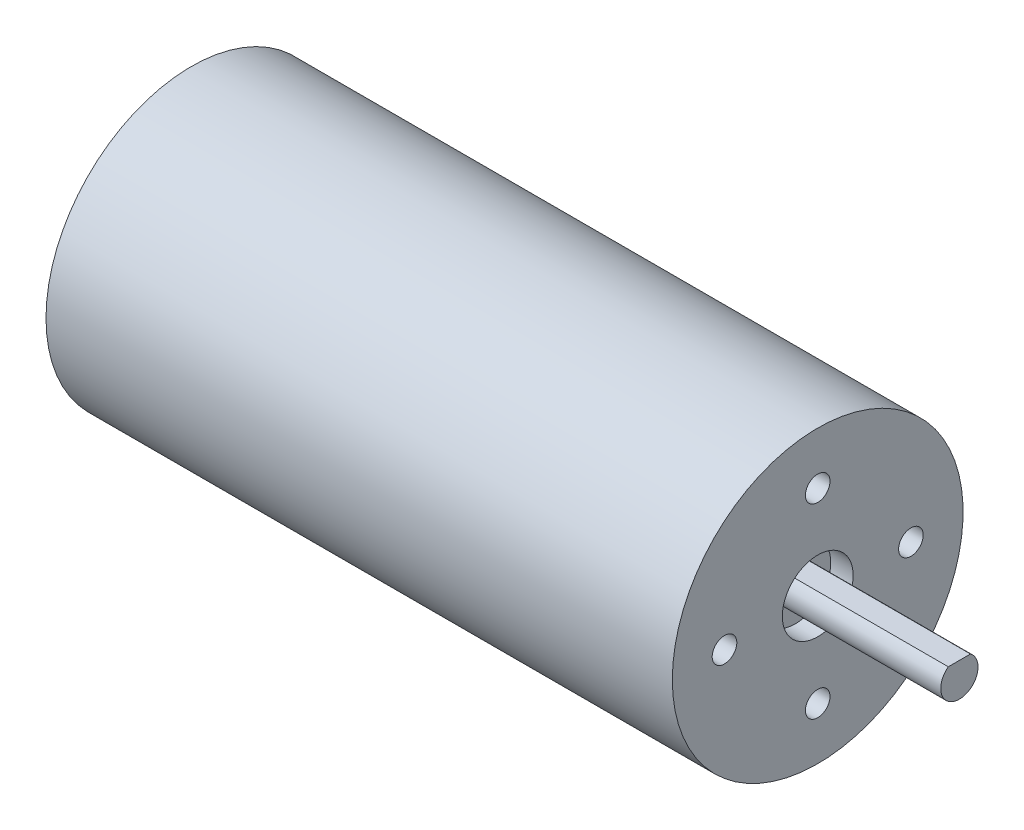
ISO-10303-21;
HEADER;
FILE_DESCRIPTION(('STEP AP214'),'2;1');
FILE_NAME('part.step','',(''),(''),'','','');
FILE_SCHEMA(('AUTOMOTIVE_DESIGN { 1 0 10303 214 1 1 1 1 }'));
ENDSEC;
DATA;
#1=APPLICATION_CONTEXT('core data for automotive mechanical design processes');
#2=APPLICATION_PROTOCOL_DEFINITION('international standard','automotive_design',2000,#1);
#3=PRODUCT_CONTEXT('',#1,'mechanical');
#4=PRODUCT('Part','Part','',(#3));
#5=PRODUCT_RELATED_PRODUCT_CATEGORY('part','',(#4));
#6=PRODUCT_DEFINITION_FORMATION('','',#4);
#7=PRODUCT_DEFINITION_CONTEXT('part definition',#1,'design');
#8=PRODUCT_DEFINITION('design','',#6,#7);
#9=PRODUCT_DEFINITION_SHAPE('','',#8);
#10=(LENGTH_UNIT() NAMED_UNIT(*) SI_UNIT(.MILLI.,.METRE.));
#11=(NAMED_UNIT(*) PLANE_ANGLE_UNIT() SI_UNIT($,.RADIAN.));
#12=(NAMED_UNIT(*) SI_UNIT($,.STERADIAN.) SOLID_ANGLE_UNIT());
#13=UNCERTAINTY_MEASURE_WITH_UNIT(LENGTH_MEASURE(1.E-05),#10,'distance_accuracy_value','');
#14=(GEOMETRIC_REPRESENTATION_CONTEXT(3) GLOBAL_UNCERTAINTY_ASSIGNED_CONTEXT((#13)) GLOBAL_UNIT_ASSIGNED_CONTEXT((#10,
#11,#12)) REPRESENTATION_CONTEXT('',''));
#15=CARTESIAN_POINT('',(0.,0.,0.));
#16=DIRECTION('',(0.,0.,1.));
#17=DIRECTION('',(1.,0.,0.));
#18=AXIS2_PLACEMENT_3D('',#15,#16,#17);
#19=CARTESIAN_POINT('',(39.,0.,0.));
#20=DIRECTION('',(1.,0.,0.));
#21=DIRECTION('',(0.,0.,-1.));
#22=AXIS2_PLACEMENT_3D('',#19,#20,#21);
#23=PLANE('',#22);
#24=CARTESIAN_POINT('',(39.,0.,0.));
#25=DIRECTION('',(1.,0.,0.));
#26=DIRECTION('',(0.,0.,-1.));
#27=AXIS2_PLACEMENT_3D('',#24,#25,#26);
#28=CIRCLE('',#27,4.75);
#29=CARTESIAN_POINT('',(39.,0.,-4.75));
#30=VERTEX_POINT('',#29);
#31=EDGE_CURVE('E178',#30,#30,#28,.T.);
#32=ORIENTED_EDGE('',*,*,#31,.T.);
#33=EDGE_LOOP('',(#32));
#34=FACE_BOUND('',#33,.T.);
#35=DIRECTION('',(0.,0.,1.));
#36=VECTOR('',#35,1.);
#37=CARTESIAN_POINT('',(39.,2.01,1.48657324071167));
#38=LINE('',#37,#36);
#39=CARTESIAN_POINT('',(39.,2.01,-1.48657324071167));
#40=VERTEX_POINT('',#39);
#41=CARTESIAN_POINT('',(39.,2.01,1.48657324071167));
#42=VERTEX_POINT('',#41);
#43=EDGE_CURVE('E169',#40,#42,#38,.T.);
#44=ORIENTED_EDGE('',*,*,#43,.F.);
#45=CARTESIAN_POINT('',(39.,0.,0.));
#46=DIRECTION('',(1.,0.,0.));
#47=DIRECTION('',(0.,0.,-1.));
#48=AXIS2_PLACEMENT_3D('',#45,#46,#47);
#49=CIRCLE('',#48,2.5);
#50=EDGE_CURVE('E55',#42,#40,#49,.T.);
#51=ORIENTED_EDGE('',*,*,#50,.F.);
#52=EDGE_LOOP('',(#44,#51));
#53=FACE_BOUND('',#52,.T.);
#54=ADVANCED_FACE('F32',(#34,#53),#23,.T.);
#55=CARTESIAN_POINT('',(42.,0.,0.));
#56=DIRECTION('',(-1.,0.,0.));
#57=DIRECTION('',(0.,0.,1.));
#58=AXIS2_PLACEMENT_3D('',#55,#56,#57);
#59=CYLINDRICAL_SURFACE('',#58,19.5);
#60=CARTESIAN_POINT('',(42.,0.,0.));
#61=DIRECTION('',(1.,0.,0.));
#62=DIRECTION('',(0.,0.,-1.));
#63=AXIS2_PLACEMENT_3D('',#60,#61,#62);
#64=CIRCLE('',#63,19.5);
#65=CARTESIAN_POINT('',(42.,0.,19.5));
#66=VERTEX_POINT('',#65);
#67=EDGE_CURVE('E11',#66,#66,#64,.T.);
#68=CARTESIAN_POINT('',(-42.,0.,0.));
#69=DIRECTION('',(1.,0.,0.));
#70=DIRECTION('',(0.,0.,-1.));
#71=AXIS2_PLACEMENT_3D('',#68,#69,#70);
#72=CIRCLE('',#71,19.5);
#73=CARTESIAN_POINT('',(-42.,0.,19.5));
#74=VERTEX_POINT('',#73);
#75=EDGE_CURVE('E36',#74,#74,#72,.T.);
#76=CARTESIAN_POINT('',(42.,0.,19.5));
#77=CARTESIAN_POINT('',(41.125,0.,19.5));
#78=CARTESIAN_POINT('',(40.25,0.,19.5));
#79=CARTESIAN_POINT('',(38.5,0.,19.5));
#80=CARTESIAN_POINT('',(37.625,0.,19.5));
#81=CARTESIAN_POINT('',(35.875,0.,19.5));
#82=CARTESIAN_POINT('',(35.,0.,19.5));
#83=CARTESIAN_POINT('',(33.25,0.,19.5));
#84=CARTESIAN_POINT('',(32.375,0.,19.5));
#85=CARTESIAN_POINT('',(30.625,0.,19.5));
#86=CARTESIAN_POINT('',(29.75,0.,19.5));
#87=CARTESIAN_POINT('',(28.,0.,19.5));
#88=CARTESIAN_POINT('',(27.125,0.,19.5));
#89=CARTESIAN_POINT('',(25.375,0.,19.5));
#90=CARTESIAN_POINT('',(24.5,0.,19.5));
#91=CARTESIAN_POINT('',(22.75,0.,19.5));
#92=CARTESIAN_POINT('',(21.875,0.,19.5));
#93=CARTESIAN_POINT('',(20.125,0.,19.5));
#94=CARTESIAN_POINT('',(19.25,0.,19.5));
#95=CARTESIAN_POINT('',(17.5,0.,19.5));
#96=CARTESIAN_POINT('',(16.625,0.,19.5));
#97=CARTESIAN_POINT('',(14.875,0.,19.5));
#98=CARTESIAN_POINT('',(14.,0.,19.5));
#99=CARTESIAN_POINT('',(12.25,0.,19.5));
#100=CARTESIAN_POINT('',(11.375,0.,19.5));
#101=CARTESIAN_POINT('',(9.62499999999999,0.,19.5));
#102=CARTESIAN_POINT('',(8.74999999999999,0.,19.5));
#103=CARTESIAN_POINT('',(6.99999999999999,0.,19.5));
#104=CARTESIAN_POINT('',(6.125,0.,19.5));
#105=CARTESIAN_POINT('',(4.375,0.,19.5));
#106=CARTESIAN_POINT('',(3.5,0.,19.5));
#107=CARTESIAN_POINT('',(1.74999999999999,0.,19.5));
#108=CARTESIAN_POINT('',(0.874999999999994,0.,19.5));
#109=CARTESIAN_POINT('',(-0.875000000000008,0.,19.5));
#110=CARTESIAN_POINT('',(-1.75000000000001,0.,19.5));
#111=CARTESIAN_POINT('',(-3.50000000000001,0.,19.5));
#112=CARTESIAN_POINT('',(-4.37500000000001,0.,19.5));
#113=CARTESIAN_POINT('',(-6.12500000000001,0.,19.5));
#114=CARTESIAN_POINT('',(-7.00000000000001,0.,19.5));
#115=CARTESIAN_POINT('',(-8.75000000000001,0.,19.5));
#116=CARTESIAN_POINT('',(-9.62500000000001,0.,19.5));
#117=CARTESIAN_POINT('',(-11.375,0.,19.5));
#118=CARTESIAN_POINT('',(-12.25,0.,19.5));
#119=CARTESIAN_POINT('',(-14.,0.,19.5));
#120=CARTESIAN_POINT('',(-14.875,0.,19.5));
#121=CARTESIAN_POINT('',(-16.625,0.,19.5));
#122=CARTESIAN_POINT('',(-17.5,0.,19.5));
#123=CARTESIAN_POINT('',(-19.25,0.,19.5));
#124=CARTESIAN_POINT('',(-20.125,0.,19.5));
#125=CARTESIAN_POINT('',(-21.875,0.,19.5));
#126=CARTESIAN_POINT('',(-22.75,0.,19.5));
#127=CARTESIAN_POINT('',(-24.5,0.,19.5));
#128=CARTESIAN_POINT('',(-25.375,0.,19.5));
#129=CARTESIAN_POINT('',(-27.125,0.,19.5));
#130=CARTESIAN_POINT('',(-28.,0.,19.5));
#131=CARTESIAN_POINT('',(-29.75,0.,19.5));
#132=CARTESIAN_POINT('',(-30.625,0.,19.5));
#133=CARTESIAN_POINT('',(-32.375,0.,19.5));
#134=CARTESIAN_POINT('',(-33.25,0.,19.5));
#135=CARTESIAN_POINT('',(-35.,0.,19.5));
#136=CARTESIAN_POINT('',(-35.875,0.,19.5));
#137=CARTESIAN_POINT('',(-37.625,0.,19.5));
#138=CARTESIAN_POINT('',(-38.5,0.,19.5));
#139=CARTESIAN_POINT('',(-40.25,0.,19.5));
#140=CARTESIAN_POINT('',(-41.125,0.,19.5));
#141=CARTESIAN_POINT('',(-42.,0.,19.5));
#142=B_SPLINE_CURVE_WITH_KNOTS('',3,(#76,#77,#78,#79,#80,#81,#82,#83,#84,#85,#86,#87,#88,#89,
#90,#91,#92,#93,#94,#95,#96,#97,#98,#99,#100,#101,#102,#103,#104,#105,#106,#107,#108,#109,#110,
#111,#112,#113,#114,#115,#116,#117,#118,#119,#120,#121,#122,#123,#124,#125,#126,#127,#128,#129,
#130,#131,#132,#133,#134,#135,#136,#137,#138,#139,#140,#141),.UNSPECIFIED.,.F.,.F.,(4,2,2,2,2,2,
2,2,2,2,2,2,2,2,2,2,2,2,2,2,2,2,2,2,2,2,2,2,2,2,2,2,4),(0.,2.625,5.25,7.87499999999999,10.5,
13.125,15.75,18.375,21.,23.625,26.25,28.875,31.5,34.125,36.75,39.375,42.,44.625,47.25,49.875,
52.5,55.125,57.75,60.375,63.,65.625,68.25,70.875,73.5,76.125,78.75,81.375,84.),.UNSPECIFIED.);
#143=EDGE_CURVE('BSEAM34',#66,#74,#142,.T.);
#144=ORIENTED_EDGE('',*,*,#67,.F.);
#145=ORIENTED_EDGE('',*,*,#75,.T.);
#146=ORIENTED_EDGE('',*,*,#143,.T.);
#147=ORIENTED_EDGE('',*,*,#143,.F.);
#148=EDGE_LOOP('',(#144,#146,#145,#147));
#149=FACE_BOUND('',#148,.T.);
#150=ADVANCED_FACE('F34',(#149),#59,.T.);
#151=CARTESIAN_POINT('',(42.,0.,0.));
#152=DIRECTION('',(1.,0.,0.));
#153=DIRECTION('',(0.,0.,-1.));
#154=AXIS2_PLACEMENT_3D('',#151,#152,#153);
#155=PLANE('',#154);
#156=CARTESIAN_POINT('',(42.,12.5,0.));
#157=DIRECTION('',(1.,0.,0.));
#158=DIRECTION('',(0.,0.,-1.));
#159=AXIS2_PLACEMENT_3D('',#156,#157,#158);
#160=CIRCLE('',#159,1.65);
#161=CARTESIAN_POINT('',(42.,12.5,-1.65));
#162=VERTEX_POINT('',#161);
#163=EDGE_CURVE('E138',#162,#162,#160,.T.);
#164=ORIENTED_EDGE('',*,*,#163,.F.);
#165=EDGE_LOOP('',(#164));
#166=FACE_BOUND('',#165,.T.);
#167=CARTESIAN_POINT('',(42.,0.,-12.5));
#168=DIRECTION('',(1.,0.,0.));
#169=DIRECTION('',(0.,0.,-1.));
#170=AXIS2_PLACEMENT_3D('',#167,#168,#169);
#171=CIRCLE('',#170,1.65);
#172=CARTESIAN_POINT('',(42.,0.,-14.15));
#173=VERTEX_POINT('',#172);
#174=EDGE_CURVE('E147',#173,#173,#171,.T.);
#175=ORIENTED_EDGE('',*,*,#174,.F.);
#176=EDGE_LOOP('',(#175));
#177=FACE_BOUND('',#176,.T.);
#178=CARTESIAN_POINT('',(42.,-12.5,0.));
#179=DIRECTION('',(1.,0.,0.));
#180=DIRECTION('',(0.,0.,-1.));
#181=AXIS2_PLACEMENT_3D('',#178,#179,#180);
#182=CIRCLE('',#181,1.65);
#183=CARTESIAN_POINT('',(42.,-12.5,-1.65));
#184=VERTEX_POINT('',#183);
#185=EDGE_CURVE('E153',#184,#184,#182,.T.);
#186=ORIENTED_EDGE('',*,*,#185,.F.);
#187=EDGE_LOOP('',(#186));
#188=FACE_BOUND('',#187,.T.);
#189=CARTESIAN_POINT('',(42.,0.,12.5));
#190=DIRECTION('',(1.,0.,0.));
#191=DIRECTION('',(0.,0.,-1.));
#192=AXIS2_PLACEMENT_3D('',#189,#190,#191);
#193=CIRCLE('',#192,1.65);
#194=CARTESIAN_POINT('',(42.,0.,10.85));
#195=VERTEX_POINT('',#194);
#196=EDGE_CURVE('E159',#195,#195,#193,.T.);
#197=ORIENTED_EDGE('',*,*,#196,.F.);
#198=EDGE_LOOP('',(#197));
#199=FACE_BOUND('',#198,.T.);
#200=CARTESIAN_POINT('',(42.,0.,0.));
#201=DIRECTION('',(1.,0.,0.));
#202=DIRECTION('',(0.,0.,-1.));
#203=AXIS2_PLACEMENT_3D('',#200,#201,#202);
#204=CIRCLE('',#203,4.75);
#205=CARTESIAN_POINT('',(42.,0.,-4.75));
#206=VERTEX_POINT('',#205);
#207=EDGE_CURVE('E177',#206,#206,#204,.T.);
#208=ORIENTED_EDGE('',*,*,#207,.F.);
#209=EDGE_LOOP('',(#208));
#210=FACE_BOUND('',#209,.T.);
#211=ORIENTED_EDGE('',*,*,#67,.T.);
#212=EDGE_LOOP('',(#211));
#213=FACE_BOUND('',#212,.T.);
#214=ADVANCED_FACE('F186',(#166,#177,#188,#199,#210,#213),#155,.T.);
#215=CARTESIAN_POINT('',(-42.,0.,0.));
#216=DIRECTION('',(1.,0.,0.));
#217=DIRECTION('',(0.,0.,-1.));
#218=AXIS2_PLACEMENT_3D('',#215,#216,#217);
#219=PLANE('',#218);
#220=CARTESIAN_POINT('',(-42.,0.,0.));
#221=DIRECTION('',(-1.,0.,0.));
#222=DIRECTION('',(0.,0.,1.));
#223=AXIS2_PLACEMENT_3D('',#220,#221,#222);
#224=CIRCLE('',#223,3.5);
#225=CARTESIAN_POINT('',(-42.,0.,3.5));
#226=VERTEX_POINT('',#225);
#227=EDGE_CURVE('E125',#226,#226,#224,.T.);
#228=ORIENTED_EDGE('',*,*,#227,.F.);
#229=EDGE_LOOP('',(#228));
#230=FACE_BOUND('',#229,.T.);
#231=DIRECTION('',(0.,0.,1.));
#232=VECTOR('',#231,1.);
#233=CARTESIAN_POINT('',(-42.,9.89,-2.185));
#234=LINE('',#233,#232);
#235=CARTESIAN_POINT('',(-42.,9.89,-2.185));
#236=VERTEX_POINT('',#235);
#237=CARTESIAN_POINT('',(-42.,9.89,2.185));
#238=VERTEX_POINT('',#237);
#239=EDGE_CURVE('E131',#236,#238,#234,.T.);
#240=ORIENTED_EDGE('',*,*,#239,.F.);
#241=CARTESIAN_POINT('',(-42.,13.46,-2.185));
#242=DIRECTION('',(-1.,0.,0.));
#243=DIRECTION('',(0.,0.,1.));
#244=AXIS2_PLACEMENT_3D('',#241,#242,#243);
#245=CIRCLE('',#244,3.57);
#246=CARTESIAN_POINT('',(-42.,17.03,-2.185));
#247=VERTEX_POINT('',#246);
#248=EDGE_CURVE('E47',#247,#236,#245,.T.);
#249=ORIENTED_EDGE('',*,*,#248,.F.);
#250=DIRECTION('',(0.,0.,-1.));
#251=VECTOR('',#250,1.);
#252=CARTESIAN_POINT('',(-42.,17.03,-2.185));
#253=LINE('',#252,#251);
#254=CARTESIAN_POINT('',(-42.,17.03,2.185));
#255=VERTEX_POINT('',#254);
#256=EDGE_CURVE('E119',#255,#247,#253,.T.);
#257=ORIENTED_EDGE('',*,*,#256,.F.);
#258=CARTESIAN_POINT('',(-42.,13.46,2.185));
#259=DIRECTION('',(-1.,0.,0.));
#260=DIRECTION('',(0.,0.,1.));
#261=AXIS2_PLACEMENT_3D('',#258,#259,#260);
#262=CIRCLE('',#261,3.57);
#263=EDGE_CURVE('E122',#238,#255,#262,.T.);
#264=ORIENTED_EDGE('',*,*,#263,.F.);
#265=EDGE_LOOP('',(#240,#249,#257,#264));
#266=FACE_BOUND('',#265,.T.);
#267=ORIENTED_EDGE('',*,*,#75,.F.);
#268=EDGE_LOOP('',(#267));
#269=FACE_BOUND('',#268,.T.);
#270=ADVANCED_FACE('F189',(#230,#266,#269),#219,.F.);
#271=CARTESIAN_POINT('',(39.,0.,0.));
#272=DIRECTION('',(1.,0.,0.));
#273=DIRECTION('',(0.,0.,-1.));
#274=AXIS2_PLACEMENT_3D('',#271,#272,#273);
#275=CYLINDRICAL_SURFACE('',#274,4.75);
#276=ORIENTED_EDGE('',*,*,#31,.F.);
#277=EDGE_LOOP('',(#276));
#278=FACE_BOUND('',#277,.T.);
#279=ORIENTED_EDGE('',*,*,#207,.T.);
#280=EDGE_LOOP('',(#279));
#281=FACE_BOUND('',#280,.T.);
#282=ADVANCED_FACE('F184',(#278,#281),#275,.F.);
#283=CARTESIAN_POINT('',(61.,0.,0.));
#284=DIRECTION('',(-1.,0.,0.));
#285=DIRECTION('',(0.,0.,1.));
#286=AXIS2_PLACEMENT_3D('',#283,#284,#285);
#287=CYLINDRICAL_SURFACE('',#286,2.5);
#288=ORIENTED_EDGE('',*,*,#50,.T.);
#289=DIRECTION('',(-1.,0.,0.));
#290=VECTOR('',#289,1.);
#291=CARTESIAN_POINT('',(61.,2.01,-1.48657324071167));
#292=LINE('',#291,#290);
#293=CARTESIAN_POINT('',(61.,2.01,-1.48657324071167));
#294=VERTEX_POINT('',#293);
#295=EDGE_CURVE('E175',#294,#40,#292,.T.);
#296=ORIENTED_EDGE('',*,*,#295,.F.);
#297=CARTESIAN_POINT('',(61.,0.,0.));
#298=DIRECTION('',(1.,0.,0.));
#299=DIRECTION('',(0.,0.,-1.));
#300=AXIS2_PLACEMENT_3D('',#297,#298,#299);
#301=CIRCLE('',#300,2.5);
#302=CARTESIAN_POINT('',(61.,2.01,1.48657324071167));
#303=VERTEX_POINT('',#302);
#304=EDGE_CURVE('E165',#303,#294,#301,.T.);
#305=ORIENTED_EDGE('',*,*,#304,.F.);
#306=DIRECTION('',(-1.,0.,0.));
#307=VECTOR('',#306,1.);
#308=CARTESIAN_POINT('',(61.,2.01,1.48657324071167));
#309=LINE('',#308,#307);
#310=EDGE_CURVE('E171',#303,#42,#309,.T.);
#311=ORIENTED_EDGE('',*,*,#310,.T.);
#312=EDGE_LOOP('',(#288,#296,#305,#311));
#313=FACE_BOUND('',#312,.T.);
#314=ADVANCED_FACE('F204',(#313),#287,.T.);
#315=CARTESIAN_POINT('',(61.,2.01,1.48657324071167));
#316=DIRECTION('',(0.,-1.,0.));
#317=DIRECTION('',(0.,0.,-1.));
#318=AXIS2_PLACEMENT_3D('',#315,#316,#317);
#319=PLANE('',#318);
#320=ORIENTED_EDGE('',*,*,#43,.T.);
#321=ORIENTED_EDGE('',*,*,#310,.F.);
#322=DIRECTION('',(0.,0.,1.));
#323=VECTOR('',#322,1.);
#324=CARTESIAN_POINT('',(61.,2.01,1.48657324071167));
#325=LINE('',#324,#323);
#326=EDGE_CURVE('E168',#294,#303,#325,.T.);
#327=ORIENTED_EDGE('',*,*,#326,.F.);
#328=ORIENTED_EDGE('',*,*,#295,.T.);
#329=EDGE_LOOP('',(#320,#321,#327,#328));
#330=FACE_BOUND('',#329,.T.);
#331=ADVANCED_FACE('F218',(#330),#319,.F.);
#332=CARTESIAN_POINT('',(61.,0.,0.));
#333=DIRECTION('',(1.,0.,0.));
#334=DIRECTION('',(0.,0.,-1.));
#335=AXIS2_PLACEMENT_3D('',#332,#333,#334);
#336=PLANE('',#335);
#337=ORIENTED_EDGE('',*,*,#304,.T.);
#338=ORIENTED_EDGE('',*,*,#326,.T.);
#339=EDGE_LOOP('',(#337,#338));
#340=FACE_BOUND('',#339,.T.);
#341=ADVANCED_FACE('F221',(#340),#336,.T.);
#342=CARTESIAN_POINT('',(31.9999946,0.,12.5));
#343=DIRECTION('',(1.,0.,0.));
#344=DIRECTION('',(0.,0.,-1.));
#345=AXIS2_PLACEMENT_3D('',#342,#343,#344);
#346=CONICAL_SURFACE('',#345,1.65,1.02974425867665);
#347=CARTESIAN_POINT('',(31.0085745786045,0.,12.5));
#348=VERTEX_POINT('',#347);
#349=VERTEX_LOOP('',#348);
#350=FACE_BOUND('',#349,.T.);
#351=CARTESIAN_POINT('',(31.9999946,0.,12.5));
#352=DIRECTION('',(1.,0.,0.));
#353=DIRECTION('',(0.,0.,-1.));
#354=AXIS2_PLACEMENT_3D('',#351,#352,#353);
#355=CIRCLE('',#354,1.65);
#356=CARTESIAN_POINT('',(31.9999946,0.,10.85));
#357=VERTEX_POINT('',#356);
#358=EDGE_CURVE('E162',#357,#357,#355,.T.);
#359=ORIENTED_EDGE('',*,*,#358,.T.);
#360=EDGE_LOOP('',(#359));
#361=FACE_BOUND('',#360,.T.);
#362=ADVANCED_FACE('F225',(#350,#361),#346,.F.);
#363=CARTESIAN_POINT('',(42.,0.,12.5));
#364=DIRECTION('',(1.,0.,0.));
#365=DIRECTION('',(0.,0.,-1.));
#366=AXIS2_PLACEMENT_3D('',#363,#364,#365);
#367=CYLINDRICAL_SURFACE('',#366,1.65);
#368=ORIENTED_EDGE('',*,*,#358,.F.);
#369=EDGE_LOOP('',(#368));
#370=FACE_BOUND('',#369,.T.);
#371=ORIENTED_EDGE('',*,*,#196,.T.);
#372=EDGE_LOOP('',(#371));
#373=FACE_BOUND('',#372,.T.);
#374=ADVANCED_FACE('F229',(#370,#373),#367,.F.);
#375=CARTESIAN_POINT('',(31.9999946,-12.5,0.));
#376=DIRECTION('',(1.,0.,0.));
#377=DIRECTION('',(0.,0.,-1.));
#378=AXIS2_PLACEMENT_3D('',#375,#376,#377);
#379=CONICAL_SURFACE('',#378,1.65,1.02974425867665);
#380=CARTESIAN_POINT('',(31.0085745786045,-12.5,0.));
#381=VERTEX_POINT('',#380);
#382=VERTEX_LOOP('',#381);
#383=FACE_BOUND('',#382,.T.);
#384=CARTESIAN_POINT('',(31.9999946,-12.5,0.));
#385=DIRECTION('',(1.,0.,0.));
#386=DIRECTION('',(0.,0.,-1.));
#387=AXIS2_PLACEMENT_3D('',#384,#385,#386);
#388=CIRCLE('',#387,1.65);
#389=CARTESIAN_POINT('',(31.9999946,-12.5,-1.65));
#390=VERTEX_POINT('',#389);
#391=EDGE_CURVE('E156',#390,#390,#388,.T.);
#392=ORIENTED_EDGE('',*,*,#391,.T.);
#393=EDGE_LOOP('',(#392));
#394=FACE_BOUND('',#393,.T.);
#395=ADVANCED_FACE('F233',(#383,#394),#379,.F.);
#396=CARTESIAN_POINT('',(42.,-12.5,0.));
#397=DIRECTION('',(1.,0.,0.));
#398=DIRECTION('',(0.,0.,-1.));
#399=AXIS2_PLACEMENT_3D('',#396,#397,#398);
#400=CYLINDRICAL_SURFACE('',#399,1.65);
#401=ORIENTED_EDGE('',*,*,#391,.F.);
#402=EDGE_LOOP('',(#401));
#403=FACE_BOUND('',#402,.T.);
#404=ORIENTED_EDGE('',*,*,#185,.T.);
#405=EDGE_LOOP('',(#404));
#406=FACE_BOUND('',#405,.T.);
#407=ADVANCED_FACE('F237',(#403,#406),#400,.F.);
#408=CARTESIAN_POINT('',(31.9999946,0.,-12.5));
#409=DIRECTION('',(1.,0.,0.));
#410=DIRECTION('',(0.,0.,-1.));
#411=AXIS2_PLACEMENT_3D('',#408,#409,#410);
#412=CONICAL_SURFACE('',#411,1.65,1.02974425867665);
#413=CARTESIAN_POINT('',(31.0085745786045,0.,-12.5));
#414=VERTEX_POINT('',#413);
#415=VERTEX_LOOP('',#414);
#416=FACE_BOUND('',#415,.T.);
#417=CARTESIAN_POINT('',(31.9999946,0.,-12.5));
#418=DIRECTION('',(1.,0.,0.));
#419=DIRECTION('',(0.,0.,-1.));
#420=AXIS2_PLACEMENT_3D('',#417,#418,#419);
#421=CIRCLE('',#420,1.65);
#422=CARTESIAN_POINT('',(31.9999946,0.,-14.15));
#423=VERTEX_POINT('',#422);
#424=EDGE_CURVE('E150',#423,#423,#421,.T.);
#425=ORIENTED_EDGE('',*,*,#424,.T.);
#426=EDGE_LOOP('',(#425));
#427=FACE_BOUND('',#426,.T.);
#428=ADVANCED_FACE('F241',(#416,#427),#412,.F.);
#429=CARTESIAN_POINT('',(42.,0.,-12.5));
#430=DIRECTION('',(1.,0.,0.));
#431=DIRECTION('',(0.,0.,-1.));
#432=AXIS2_PLACEMENT_3D('',#429,#430,#431);
#433=CYLINDRICAL_SURFACE('',#432,1.65);
#434=ORIENTED_EDGE('',*,*,#424,.F.);
#435=EDGE_LOOP('',(#434));
#436=FACE_BOUND('',#435,.T.);
#437=ORIENTED_EDGE('',*,*,#174,.T.);
#438=EDGE_LOOP('',(#437));
#439=FACE_BOUND('',#438,.T.);
#440=ADVANCED_FACE('F245',(#436,#439),#433,.F.);
#441=CARTESIAN_POINT('',(31.9999946,12.5,0.));
#442=DIRECTION('',(1.,0.,0.));
#443=DIRECTION('',(0.,0.,-1.));
#444=AXIS2_PLACEMENT_3D('',#441,#442,#443);
#445=CONICAL_SURFACE('',#444,1.65,1.02974425867665);
#446=CARTESIAN_POINT('',(31.0085745786045,12.5,0.));
#447=VERTEX_POINT('',#446);
#448=VERTEX_LOOP('',#447);
#449=FACE_BOUND('',#448,.T.);
#450=CARTESIAN_POINT('',(31.9999946,12.5,0.));
#451=DIRECTION('',(1.,0.,0.));
#452=DIRECTION('',(0.,0.,-1.));
#453=AXIS2_PLACEMENT_3D('',#450,#451,#452);
#454=CIRCLE('',#453,1.65);
#455=CARTESIAN_POINT('',(31.9999946,12.5,-1.65));
#456=VERTEX_POINT('',#455);
#457=EDGE_CURVE('E144',#456,#456,#454,.T.);
#458=ORIENTED_EDGE('',*,*,#457,.T.);
#459=EDGE_LOOP('',(#458));
#460=FACE_BOUND('',#459,.T.);
#461=ADVANCED_FACE('F249',(#449,#460),#445,.F.);
#462=CARTESIAN_POINT('',(42.,12.5,0.));
#463=DIRECTION('',(1.,0.,0.));
#464=DIRECTION('',(0.,0.,-1.));
#465=AXIS2_PLACEMENT_3D('',#462,#463,#464);
#466=CYLINDRICAL_SURFACE('',#465,1.65);
#467=ORIENTED_EDGE('',*,*,#457,.F.);
#468=EDGE_LOOP('',(#467));
#469=FACE_BOUND('',#468,.T.);
#470=ORIENTED_EDGE('',*,*,#163,.T.);
#471=EDGE_LOOP('',(#470));
#472=FACE_BOUND('',#471,.T.);
#473=ADVANCED_FACE('F253',(#469,#472),#466,.F.);
#474=CARTESIAN_POINT('',(-40.67,13.46,-2.185));
#475=DIRECTION('',(-1.,0.,0.));
#476=DIRECTION('',(0.,0.,1.));
#477=AXIS2_PLACEMENT_3D('',#474,#475,#476);
#478=CYLINDRICAL_SURFACE('',#477,3.57);
#479=ORIENTED_EDGE('',*,*,#248,.T.);
#480=DIRECTION('',(-1.,0.,0.));
#481=VECTOR('',#480,1.);
#482=CARTESIAN_POINT('',(-40.67,9.89,-2.185));
#483=LINE('',#482,#481);
#484=CARTESIAN_POINT('',(-40.67,9.89,-2.185));
#485=VERTEX_POINT('',#484);
#486=EDGE_CURVE('E97',#485,#236,#483,.T.);
#487=ORIENTED_EDGE('',*,*,#486,.F.);
#488=CARTESIAN_POINT('',(-40.67,13.46,-2.185));
#489=DIRECTION('',(-1.,0.,0.));
#490=DIRECTION('',(0.,0.,1.));
#491=AXIS2_PLACEMENT_3D('',#488,#489,#490);
#492=CIRCLE('',#491,3.57);
#493=CARTESIAN_POINT('',(-40.67,17.03,-2.185));
#494=VERTEX_POINT('',#493);
#495=EDGE_CURVE('E101',#494,#485,#492,.T.);
#496=ORIENTED_EDGE('',*,*,#495,.F.);
#497=DIRECTION('',(-1.,0.,0.));
#498=VECTOR('',#497,1.);
#499=CARTESIAN_POINT('',(-40.67,17.03,-2.185));
#500=LINE('',#499,#498);
#501=EDGE_CURVE('E136',#494,#247,#500,.T.);
#502=ORIENTED_EDGE('',*,*,#501,.T.);
#503=EDGE_LOOP('',(#479,#487,#496,#502));
#504=FACE_BOUND('',#503,.T.);
#505=ADVANCED_FACE('F99',(#504),#478,.F.);
#506=CARTESIAN_POINT('',(-40.67,17.03,-2.185));
#507=DIRECTION('',(0.,1.,0.));
#508=DIRECTION('',(0.,0.,1.));
#509=AXIS2_PLACEMENT_3D('',#506,#507,#508);
#510=PLANE('',#509);
#511=ORIENTED_EDGE('',*,*,#256,.T.);
#512=ORIENTED_EDGE('',*,*,#501,.F.);
#513=DIRECTION('',(0.,0.,-1.));
#514=VECTOR('',#513,1.);
#515=CARTESIAN_POINT('',(-40.67,17.03,-2.185));
#516=LINE('',#515,#514);
#517=CARTESIAN_POINT('',(-40.67,17.03,2.185));
#518=VERTEX_POINT('',#517);
#519=EDGE_CURVE('E107',#518,#494,#516,.T.);
#520=ORIENTED_EDGE('',*,*,#519,.F.);
#521=DIRECTION('',(-1.,0.,0.));
#522=VECTOR('',#521,1.);
#523=CARTESIAN_POINT('',(-40.67,17.03,2.185));
#524=LINE('',#523,#522);
#525=EDGE_CURVE('E139',#518,#255,#524,.T.);
#526=ORIENTED_EDGE('',*,*,#525,.T.);
#527=EDGE_LOOP('',(#511,#512,#520,#526));
#528=FACE_BOUND('',#527,.T.);
#529=ADVANCED_FACE('F260',(#528),#510,.F.);
#530=CARTESIAN_POINT('',(-40.67,13.46,2.185));
#531=DIRECTION('',(-1.,0.,0.));
#532=DIRECTION('',(0.,0.,1.));
#533=AXIS2_PLACEMENT_3D('',#530,#531,#532);
#534=CYLINDRICAL_SURFACE('',#533,3.57);
#535=ORIENTED_EDGE('',*,*,#263,.T.);
#536=ORIENTED_EDGE('',*,*,#525,.F.);
#537=CARTESIAN_POINT('',(-40.67,13.46,2.185));
#538=DIRECTION('',(-1.,0.,0.));
#539=DIRECTION('',(0.,0.,1.));
#540=AXIS2_PLACEMENT_3D('',#537,#538,#539);
#541=CIRCLE('',#540,3.57);
#542=CARTESIAN_POINT('',(-40.67,9.89,2.185));
#543=VERTEX_POINT('',#542);
#544=EDGE_CURVE('E115',#543,#518,#541,.T.);
#545=ORIENTED_EDGE('',*,*,#544,.F.);
#546=DIRECTION('',(-1.,0.,0.));
#547=VECTOR('',#546,1.);
#548=CARTESIAN_POINT('',(-40.67,9.89,2.185));
#549=LINE('',#548,#547);
#550=EDGE_CURVE('E106',#543,#238,#549,.T.);
#551=ORIENTED_EDGE('',*,*,#550,.T.);
#552=EDGE_LOOP('',(#535,#536,#545,#551));
#553=FACE_BOUND('',#552,.T.);
#554=ADVANCED_FACE('F263',(#553),#534,.F.);
#555=CARTESIAN_POINT('',(-40.67,9.89,-2.185));
#556=DIRECTION('',(0.,-1.,0.));
#557=DIRECTION('',(0.,0.,-1.));
#558=AXIS2_PLACEMENT_3D('',#555,#556,#557);
#559=PLANE('',#558);
#560=ORIENTED_EDGE('',*,*,#239,.T.);
#561=ORIENTED_EDGE('',*,*,#550,.F.);
#562=DIRECTION('',(0.,0.,1.));
#563=VECTOR('',#562,1.);
#564=CARTESIAN_POINT('',(-40.67,9.89,-2.185));
#565=LINE('',#564,#563);
#566=EDGE_CURVE('E110',#485,#543,#565,.T.);
#567=ORIENTED_EDGE('',*,*,#566,.F.);
#568=ORIENTED_EDGE('',*,*,#486,.T.);
#569=EDGE_LOOP('',(#560,#561,#567,#568));
#570=FACE_BOUND('',#569,.T.);
#571=ADVANCED_FACE('F111',(#570),#559,.F.);
#572=CARTESIAN_POINT('',(-40.67,13.46,-2.185));
#573=DIRECTION('',(-1.,0.,0.));
#574=DIRECTION('',(0.,0.,1.));
#575=AXIS2_PLACEMENT_3D('',#572,#573,#574);
#576=PLANE('',#575);
#577=ORIENTED_EDGE('',*,*,#495,.T.);
#578=ORIENTED_EDGE('',*,*,#566,.T.);
#579=ORIENTED_EDGE('',*,*,#544,.T.);
#580=ORIENTED_EDGE('',*,*,#519,.T.);
#581=EDGE_LOOP('',(#577,#578,#579,#580));
#582=FACE_BOUND('',#581,.T.);
#583=ADVANCED_FACE('F117',(#582),#576,.T.);
#584=CARTESIAN_POINT('',(-40.67,0.,0.));
#585=DIRECTION('',(-1.,0.,0.));
#586=DIRECTION('',(0.,0.,1.));
#587=AXIS2_PLACEMENT_3D('',#584,#585,#586);
#588=CYLINDRICAL_SURFACE('',#587,3.5);
#589=CARTESIAN_POINT('',(-40.67,0.,0.));
#590=DIRECTION('',(-1.,0.,0.));
#591=DIRECTION('',(0.,0.,1.));
#592=AXIS2_PLACEMENT_3D('',#589,#590,#591);
#593=CIRCLE('',#592,3.5);
#594=CARTESIAN_POINT('',(-40.67,0.,3.5));
#595=VERTEX_POINT('',#594);
#596=EDGE_CURVE('E132',#595,#595,#593,.T.);
#597=ORIENTED_EDGE('',*,*,#596,.F.);
#598=EDGE_LOOP('',(#597));
#599=FACE_BOUND('',#598,.T.);
#600=ORIENTED_EDGE('',*,*,#227,.T.);
#601=EDGE_LOOP('',(#600));
#602=FACE_BOUND('',#601,.T.);
#603=ADVANCED_FACE('F272',(#599,#602),#588,.F.);
#604=CARTESIAN_POINT('',(-40.67,0.,0.));
#605=DIRECTION('',(-1.,0.,0.));
#606=DIRECTION('',(0.,0.,1.));
#607=AXIS2_PLACEMENT_3D('',#604,#605,#606);
#608=PLANE('',#607);
#609=ORIENTED_EDGE('',*,*,#596,.T.);
#610=EDGE_LOOP('',(#609));
#611=FACE_BOUND('',#610,.T.);
#612=ADVANCED_FACE('F275',(#611),#608,.T.);
#613=CLOSED_SHELL('',(#54,#150,#214,#270,#282,#314,#331,#341,#362,#374,#395,#407,#428,#440,#461,
#473,#505,#529,#554,#571,#583,#603,#612));
#614=MANIFOLD_SOLID_BREP('B2',#613);
#615=ADVANCED_BREP_SHAPE_REPRESENTATION('',(#18,#614),#14);
#616=SHAPE_DEFINITION_REPRESENTATION(#9,#615);
ENDSEC;
END-ISO-10303-21;
